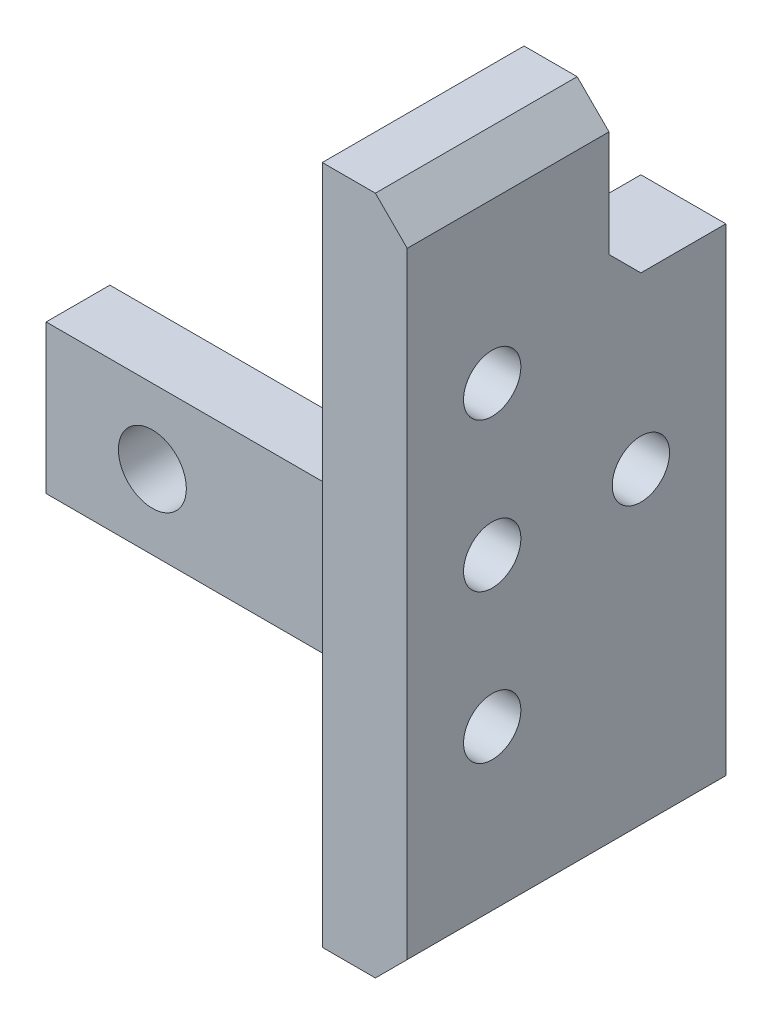
ISO-10303-21;
HEADER;
FILE_DESCRIPTION(('STEP AP214'),'2;1');
FILE_NAME('part.step','',(''),(''),'','','');
FILE_SCHEMA(('AUTOMOTIVE_DESIGN { 1 0 10303 214 1 1 1 1 }'));
ENDSEC;
DATA;
#1=APPLICATION_CONTEXT('core data for automotive mechanical design processes');
#2=APPLICATION_PROTOCOL_DEFINITION('international standard','automotive_design',2000,#1);
#3=PRODUCT_CONTEXT('',#1,'mechanical');
#4=PRODUCT('Part','Part','',(#3));
#5=PRODUCT_RELATED_PRODUCT_CATEGORY('part','',(#4));
#6=PRODUCT_DEFINITION_FORMATION('','',#4);
#7=PRODUCT_DEFINITION_CONTEXT('part definition',#1,'design');
#8=PRODUCT_DEFINITION('design','',#6,#7);
#9=PRODUCT_DEFINITION_SHAPE('','',#8);
#10=(LENGTH_UNIT() NAMED_UNIT(*) SI_UNIT(.MILLI.,.METRE.));
#11=(NAMED_UNIT(*) PLANE_ANGLE_UNIT() SI_UNIT($,.RADIAN.));
#12=(NAMED_UNIT(*) SI_UNIT($,.STERADIAN.) SOLID_ANGLE_UNIT());
#13=UNCERTAINTY_MEASURE_WITH_UNIT(LENGTH_MEASURE(1.E-05),#10,'distance_accuracy_value','');
#14=(GEOMETRIC_REPRESENTATION_CONTEXT(3) GLOBAL_UNCERTAINTY_ASSIGNED_CONTEXT((#13)) GLOBAL_UNIT_ASSIGNED_CONTEXT((#10,
#11,#12)) REPRESENTATION_CONTEXT('',''));
#15=CARTESIAN_POINT('',(0.,0.,0.));
#16=DIRECTION('',(0.,0.,1.));
#17=DIRECTION('',(1.,0.,0.));
#18=AXIS2_PLACEMENT_3D('',#15,#16,#17);
#19=CARTESIAN_POINT('',(0.,-3.5,3.));
#20=DIRECTION('',(0.,1.,0.));
#21=DIRECTION('',(-1.,0.,0.));
#22=AXIS2_PLACEMENT_3D('',#19,#20,#21);
#23=PLANE('',#22);
#24=DIRECTION('',(1.,0.,0.));
#25=VECTOR('',#24,1.);
#26=CARTESIAN_POINT('',(0.,-3.5,0.));
#27=LINE('',#26,#25);
#28=CARTESIAN_POINT('',(0.,-3.5,0.));
#29=VERTEX_POINT('',#28);
#30=CARTESIAN_POINT('',(27.5,-3.49999999999999,0.));
#31=VERTEX_POINT('',#30);
#32=EDGE_CURVE('E210',#29,#31,#27,.T.);
#33=ORIENTED_EDGE('',*,*,#32,.T.);
#34=DIRECTION('',(0.,0.,1.));
#35=VECTOR('',#34,1.);
#36=CARTESIAN_POINT('',(27.5,-3.49999999999999,15.));
#37=LINE('',#36,#35);
#38=CARTESIAN_POINT('',(27.5,-3.49999999999999,15.));
#39=VERTEX_POINT('',#38);
#40=EDGE_CURVE('E250',#31,#39,#37,.T.);
#41=ORIENTED_EDGE('',*,*,#40,.T.);
#42=DIRECTION('',(-1.,0.,0.));
#43=VECTOR('',#42,1.);
#44=CARTESIAN_POINT('',(29.,-3.49999999999999,15.));
#45=LINE('',#44,#43);
#46=CARTESIAN_POINT('',(25.,-3.49999999999999,15.));
#47=VERTEX_POINT('',#46);
#48=EDGE_CURVE('E192',#39,#47,#45,.T.);
#49=ORIENTED_EDGE('',*,*,#48,.T.);
#50=DIRECTION('',(0.,0.,-1.));
#51=VECTOR('',#50,1.);
#52=CARTESIAN_POINT('',(25.,-3.49999999999999,0.));
#53=LINE('',#52,#51);
#54=CARTESIAN_POINT('',(25.,-3.49999999999999,4.99999999999998));
#55=VERTEX_POINT('',#54);
#56=EDGE_CURVE('E149',#47,#55,#53,.T.);
#57=ORIENTED_EDGE('',*,*,#56,.T.);
#58=DIRECTION('',(-0.707106781186551,0.,-0.707106781186544));
#59=VECTOR('',#58,1.);
#60=CARTESIAN_POINT('',(11.4999999999999,-3.5,-8.5));
#61=LINE('',#60,#59);
#62=CARTESIAN_POINT('',(23.,-3.49999999999999,3.));
#63=VERTEX_POINT('',#62);
#64=EDGE_CURVE('E11',#55,#63,#61,.T.);
#65=ORIENTED_EDGE('',*,*,#64,.T.);
#66=DIRECTION('',(1.,0.,0.));
#67=VECTOR('',#66,1.);
#68=CARTESIAN_POINT('',(0.,-3.5,3.));
#69=LINE('',#68,#67);
#70=CARTESIAN_POINT('',(0.,-3.5,3.));
#71=VERTEX_POINT('',#70);
#72=EDGE_CURVE('E211',#71,#63,#69,.T.);
#73=ORIENTED_EDGE('',*,*,#72,.F.);
#74=DIRECTION('',(0.,0.,-1.));
#75=VECTOR('',#74,1.);
#76=CARTESIAN_POINT('',(0.,-3.5,3.));
#77=LINE('',#76,#75);
#78=EDGE_CURVE('E224',#71,#29,#77,.T.);
#79=ORIENTED_EDGE('',*,*,#78,.T.);
#80=EDGE_LOOP('',(#33,#41,#49,#57,#65,#73,#79));
#81=FACE_BOUND('',#80,.T.);
#82=ADVANCED_FACE('F41',(#81),#23,.F.);
#83=CARTESIAN_POINT('',(0.,3.5,3.));
#84=DIRECTION('',(0.,1.,0.));
#85=DIRECTION('',(0.,0.,1.));
#86=AXIS2_PLACEMENT_3D('',#83,#84,#85);
#87=PLANE('',#86);
#88=DIRECTION('',(1.,0.,0.));
#89=VECTOR('',#88,1.);
#90=CARTESIAN_POINT('',(0.,3.5,0.));
#91=LINE('',#90,#89);
#92=CARTESIAN_POINT('',(0.,3.5,0.));
#93=VERTEX_POINT('',#92);
#94=CARTESIAN_POINT('',(25.,3.5,0.));
#95=VERTEX_POINT('',#94);
#96=EDGE_CURVE('E228',#93,#95,#91,.T.);
#97=ORIENTED_EDGE('',*,*,#96,.F.);
#98=DIRECTION('',(0.,0.,-1.));
#99=VECTOR('',#98,1.);
#100=CARTESIAN_POINT('',(0.,3.5,3.));
#101=LINE('',#100,#99);
#102=CARTESIAN_POINT('',(0.,3.5,3.));
#103=VERTEX_POINT('',#102);
#104=EDGE_CURVE('E236',#103,#93,#101,.T.);
#105=ORIENTED_EDGE('',*,*,#104,.F.);
#106=DIRECTION('',(1.,0.,0.));
#107=VECTOR('',#106,1.);
#108=CARTESIAN_POINT('',(0.,3.5,3.));
#109=LINE('',#108,#107);
#110=CARTESIAN_POINT('',(23.,3.5,3.));
#111=VERTEX_POINT('',#110);
#112=EDGE_CURVE('E215',#103,#111,#109,.T.);
#113=ORIENTED_EDGE('',*,*,#112,.T.);
#114=DIRECTION('',(0.707106781186551,0.,0.707106781186544));
#115=VECTOR('',#114,1.);
#116=CARTESIAN_POINT('',(23.,3.5,3.));
#117=LINE('',#116,#115);
#118=CARTESIAN_POINT('',(25.,3.5,4.99999999999998));
#119=VERTEX_POINT('',#118);
#120=EDGE_CURVE('E51',#111,#119,#117,.T.);
#121=ORIENTED_EDGE('',*,*,#120,.T.);
#122=DIRECTION('',(0.,0.,-1.));
#123=VECTOR('',#122,1.);
#124=CARTESIAN_POINT('',(25.,3.5,3.));
#125=LINE('',#124,#123);
#126=EDGE_CURVE('E58',#119,#95,#125,.T.);
#127=ORIENTED_EDGE('',*,*,#126,.T.);
#128=EDGE_LOOP('',(#97,#105,#113,#121,#127));
#129=FACE_BOUND('',#128,.T.);
#130=ADVANCED_FACE('F284',(#129),#87,.T.);
#131=CARTESIAN_POINT('',(0.,-3.5,3.));
#132=DIRECTION('',(-1.,0.,0.));
#133=DIRECTION('',(0.,-1.,0.));
#134=AXIS2_PLACEMENT_3D('',#131,#132,#133);
#135=PLANE('',#134);
#136=DIRECTION('',(0.,1.,0.));
#137=VECTOR('',#136,1.);
#138=CARTESIAN_POINT('',(0.,-3.5,0.));
#139=LINE('',#138,#137);
#140=EDGE_CURVE('E216',#29,#93,#139,.T.);
#141=ORIENTED_EDGE('',*,*,#140,.F.);
#142=ORIENTED_EDGE('',*,*,#78,.F.);
#143=DIRECTION('',(0.,1.,0.));
#144=VECTOR('',#143,1.);
#145=CARTESIAN_POINT('',(0.,-3.5,3.));
#146=LINE('',#145,#144);
#147=EDGE_CURVE('E220',#71,#103,#146,.T.);
#148=ORIENTED_EDGE('',*,*,#147,.T.);
#149=ORIENTED_EDGE('',*,*,#104,.T.);
#150=EDGE_LOOP('',(#141,#142,#148,#149));
#151=FACE_BOUND('',#150,.T.);
#152=ADVANCED_FACE('F296',(#151),#135,.T.);
#153=CARTESIAN_POINT('',(0.,0.,3.));
#154=DIRECTION('',(0.,0.,1.));
#155=DIRECTION('',(1.,0.,0.));
#156=AXIS2_PLACEMENT_3D('',#153,#154,#155);
#157=PLANE('',#156);
#158=CARTESIAN_POINT('',(5.,0.,3.));
#159=DIRECTION('',(0.,0.,1.));
#160=DIRECTION('',(1.,0.,0.));
#161=AXIS2_PLACEMENT_3D('',#158,#159,#160);
#162=CIRCLE('',#161,1.6);
#163=CARTESIAN_POINT('',(6.6,0.,3.));
#164=VERTEX_POINT('',#163);
#165=EDGE_CURVE('E183',#164,#164,#162,.T.);
#166=ORIENTED_EDGE('',*,*,#165,.F.);
#167=EDGE_LOOP('',(#166));
#168=FACE_BOUND('',#167,.T.);
#169=CARTESIAN_POINT('',(20.,0.,3.));
#170=DIRECTION('',(0.,0.,1.));
#171=DIRECTION('',(1.,0.,0.));
#172=AXIS2_PLACEMENT_3D('',#169,#170,#171);
#173=CIRCLE('',#172,1.6);
#174=CARTESIAN_POINT('',(21.6,0.,3.));
#175=VERTEX_POINT('',#174);
#176=EDGE_CURVE('E168',#175,#175,#173,.T.);
#177=ORIENTED_EDGE('',*,*,#176,.F.);
#178=EDGE_LOOP('',(#177));
#179=FACE_BOUND('',#178,.T.);
#180=ORIENTED_EDGE('',*,*,#72,.T.);
#181=DIRECTION('',(0.,1.,0.));
#182=VECTOR('',#181,1.);
#183=CARTESIAN_POINT('',(23.,0.,3.));
#184=LINE('',#183,#182);
#185=EDGE_CURVE('E276',#63,#111,#184,.T.);
#186=ORIENTED_EDGE('',*,*,#185,.T.);
#187=ORIENTED_EDGE('',*,*,#112,.F.);
#188=ORIENTED_EDGE('',*,*,#147,.F.);
#189=EDGE_LOOP('',(#180,#186,#187,#188));
#190=FACE_BOUND('',#189,.T.);
#191=ADVANCED_FACE('F293',(#168,#179,#190),#157,.T.);
#192=CARTESIAN_POINT('',(0.,0.,0.));
#193=DIRECTION('',(0.,0.,1.));
#194=DIRECTION('',(1.,0.,0.));
#195=AXIS2_PLACEMENT_3D('',#192,#193,#194);
#196=PLANE('',#195);
#197=CARTESIAN_POINT('',(5.,0.,0.));
#198=DIRECTION('',(0.,0.,1.));
#199=DIRECTION('',(1.,0.,0.));
#200=AXIS2_PLACEMENT_3D('',#197,#198,#199);
#201=CIRCLE('',#200,1.6);
#202=CARTESIAN_POINT('',(6.6,0.,0.));
#203=VERTEX_POINT('',#202);
#204=EDGE_CURVE('E179',#203,#203,#201,.T.);
#205=ORIENTED_EDGE('',*,*,#204,.T.);
#206=EDGE_LOOP('',(#205));
#207=FACE_BOUND('',#206,.T.);
#208=CARTESIAN_POINT('',(20.,0.,0.));
#209=DIRECTION('',(0.,0.,1.));
#210=DIRECTION('',(1.,0.,0.));
#211=AXIS2_PLACEMENT_3D('',#208,#209,#210);
#212=CIRCLE('',#211,1.6);
#213=CARTESIAN_POINT('',(21.6,0.,0.));
#214=VERTEX_POINT('',#213);
#215=EDGE_CURVE('E173',#214,#214,#212,.T.);
#216=ORIENTED_EDGE('',*,*,#215,.T.);
#217=EDGE_LOOP('',(#216));
#218=FACE_BOUND('',#217,.T.);
#219=DIRECTION('',(0.,1.,0.));
#220=VECTOR('',#219,1.);
#221=CARTESIAN_POINT('',(29.,-3.49999999999999,0.));
#222=LINE('',#221,#220);
#223=CARTESIAN_POINT('',(29.,-1.99999999999999,0.));
#224=VERTEX_POINT('',#223);
#225=CARTESIAN_POINT('',(29.,20.5,0.));
#226=VERTEX_POINT('',#225);
#227=EDGE_CURVE('E138',#224,#226,#222,.T.);
#228=ORIENTED_EDGE('',*,*,#227,.F.);
#229=DIRECTION('',(-0.707106781186549,-0.707106781186546,0.));
#230=VECTOR('',#229,1.);
#231=CARTESIAN_POINT('',(29.,-1.99999999999999,0.));
#232=LINE('',#231,#230);
#233=EDGE_CURVE('E247',#224,#31,#232,.T.);
#234=ORIENTED_EDGE('',*,*,#233,.T.);
#235=ORIENTED_EDGE('',*,*,#32,.F.);
#236=ORIENTED_EDGE('',*,*,#140,.T.);
#237=ORIENTED_EDGE('',*,*,#96,.T.);
#238=DIRECTION('',(0.,1.,0.));
#239=VECTOR('',#238,1.);
#240=CARTESIAN_POINT('',(25.,-3.49999999999999,0.));
#241=LINE('',#240,#239);
#242=CARTESIAN_POINT('',(25.,20.5,0.));
#243=VERTEX_POINT('',#242);
#244=EDGE_CURVE('E166',#95,#243,#241,.T.);
#245=ORIENTED_EDGE('',*,*,#244,.T.);
#246=DIRECTION('',(1.,0.,0.));
#247=VECTOR('',#246,1.);
#248=CARTESIAN_POINT('',(-0.001000000000001,20.5,0.));
#249=LINE('',#248,#247);
#250=EDGE_CURVE('E155',#243,#226,#249,.T.);
#251=ORIENTED_EDGE('',*,*,#250,.T.);
#252=EDGE_LOOP('',(#228,#234,#235,#236,#237,#245,#251));
#253=FACE_BOUND('',#252,.T.);
#254=ADVANCED_FACE('F164',(#207,#218,#253),#196,.F.);
#255=CARTESIAN_POINT('',(29.,28.5,0.));
#256=DIRECTION('',(0.,-1.,0.));
#257=DIRECTION('',(0.,0.,-1.));
#258=AXIS2_PLACEMENT_3D('',#255,#256,#257);
#259=PLANE('',#258);
#260=DIRECTION('',(-1.,0.,0.));
#261=VECTOR('',#260,1.);
#262=CARTESIAN_POINT('',(29.,28.5,15.));
#263=LINE('',#262,#261);
#264=CARTESIAN_POINT('',(27.5,28.5,15.));
#265=VERTEX_POINT('',#264);
#266=CARTESIAN_POINT('',(25.,28.5,15.));
#267=VERTEX_POINT('',#266);
#268=EDGE_CURVE('E207',#265,#267,#263,.T.);
#269=ORIENTED_EDGE('',*,*,#268,.F.);
#270=DIRECTION('',(0.,0.,-1.));
#271=VECTOR('',#270,1.);
#272=CARTESIAN_POINT('',(27.5,28.5,5.5));
#273=LINE('',#272,#271);
#274=CARTESIAN_POINT('',(27.5,28.5,5.5));
#275=VERTEX_POINT('',#274);
#276=EDGE_CURVE('E259',#265,#275,#273,.T.);
#277=ORIENTED_EDGE('',*,*,#276,.T.);
#278=DIRECTION('',(1.,0.,0.));
#279=VECTOR('',#278,1.);
#280=CARTESIAN_POINT('',(-0.001000000000001,28.5,5.5));
#281=LINE('',#280,#279);
#282=CARTESIAN_POINT('',(25.,28.5,5.5));
#283=VERTEX_POINT('',#282);
#284=EDGE_CURVE('E160',#283,#275,#281,.T.);
#285=ORIENTED_EDGE('',*,*,#284,.F.);
#286=DIRECTION('',(0.,0.,1.));
#287=VECTOR('',#286,1.);
#288=CARTESIAN_POINT('',(25.,28.5,0.));
#289=LINE('',#288,#287);
#290=EDGE_CURVE('E195',#283,#267,#289,.T.);
#291=ORIENTED_EDGE('',*,*,#290,.T.);
#292=EDGE_LOOP('',(#269,#277,#285,#291));
#293=FACE_BOUND('',#292,.T.);
#294=ADVANCED_FACE('F443',(#293),#259,.F.);
#295=CARTESIAN_POINT('',(29.,-3.49999999999999,15.));
#296=DIRECTION('',(0.,0.,-1.));
#297=DIRECTION('',(-1.,0.,0.));
#298=AXIS2_PLACEMENT_3D('',#295,#296,#297);
#299=PLANE('',#298);
#300=ORIENTED_EDGE('',*,*,#48,.F.);
#301=DIRECTION('',(0.707106781186549,0.707106781186546,0.));
#302=VECTOR('',#301,1.);
#303=CARTESIAN_POINT('',(29.,-1.99999999999999,15.));
#304=LINE('',#303,#302);
#305=CARTESIAN_POINT('',(29.,-1.99999999999999,15.));
#306=VERTEX_POINT('',#305);
#307=EDGE_CURVE('E256',#39,#306,#304,.T.);
#308=ORIENTED_EDGE('',*,*,#307,.T.);
#309=DIRECTION('',(0.,-1.,0.));
#310=VECTOR('',#309,1.);
#311=CARTESIAN_POINT('',(29.,-3.49999999999999,15.));
#312=LINE('',#311,#310);
#313=CARTESIAN_POINT('',(29.,27.,15.));
#314=VERTEX_POINT('',#313);
#315=EDGE_CURVE('E148',#314,#306,#312,.T.);
#316=ORIENTED_EDGE('',*,*,#315,.F.);
#317=DIRECTION('',(-0.707106781186549,0.707106781186546,0.));
#318=VECTOR('',#317,1.);
#319=CARTESIAN_POINT('',(29.,27.,15.));
#320=LINE('',#319,#318);
#321=EDGE_CURVE('E253',#314,#265,#320,.T.);
#322=ORIENTED_EDGE('',*,*,#321,.T.);
#323=ORIENTED_EDGE('',*,*,#268,.T.);
#324=DIRECTION('',(0.,-1.,0.));
#325=VECTOR('',#324,1.);
#326=CARTESIAN_POINT('',(25.,-3.49999999999999,15.));
#327=LINE('',#326,#325);
#328=EDGE_CURVE('E199',#267,#47,#327,.T.);
#329=ORIENTED_EDGE('',*,*,#328,.T.);
#330=EDGE_LOOP('',(#300,#308,#316,#322,#323,#329));
#331=FACE_BOUND('',#330,.T.);
#332=ADVANCED_FACE('F304',(#331),#299,.F.);
#333=CARTESIAN_POINT('',(29.,0.,0.));
#334=DIRECTION('',(1.,0.,0.));
#335=DIRECTION('',(0.,0.,-1.));
#336=AXIS2_PLACEMENT_3D('',#333,#334,#335);
#337=PLANE('',#336);
#338=CARTESIAN_POINT('',(29.,19.5,11.));
#339=DIRECTION('',(1.,0.,0.));
#340=DIRECTION('',(0.,0.,-1.));
#341=AXIS2_PLACEMENT_3D('',#338,#339,#340);
#342=CIRCLE('',#341,1.35);
#343=CARTESIAN_POINT('',(29.,19.5,9.65));
#344=VERTEX_POINT('',#343);
#345=EDGE_CURVE('E381',#344,#344,#342,.T.);
#346=ORIENTED_EDGE('',*,*,#345,.F.);
#347=EDGE_LOOP('',(#346));
#348=FACE_BOUND('',#347,.T.);
#349=CARTESIAN_POINT('',(29.,5.50000000000001,11.));
#350=DIRECTION('',(1.,0.,0.));
#351=DIRECTION('',(0.,0.,-1.));
#352=AXIS2_PLACEMENT_3D('',#349,#350,#351);
#353=CIRCLE('',#352,1.35);
#354=CARTESIAN_POINT('',(29.,5.50000000000001,9.65));
#355=VERTEX_POINT('',#354);
#356=EDGE_CURVE('E380',#355,#355,#353,.T.);
#357=ORIENTED_EDGE('',*,*,#356,.F.);
#358=EDGE_LOOP('',(#357));
#359=FACE_BOUND('',#358,.T.);
#360=CARTESIAN_POINT('',(29.,12.5,4.));
#361=DIRECTION('',(1.,0.,0.));
#362=DIRECTION('',(0.,0.,-1.));
#363=AXIS2_PLACEMENT_3D('',#360,#361,#362);
#364=CIRCLE('',#363,1.35);
#365=CARTESIAN_POINT('',(29.,12.5,2.65));
#366=VERTEX_POINT('',#365);
#367=EDGE_CURVE('E389',#366,#366,#364,.T.);
#368=ORIENTED_EDGE('',*,*,#367,.F.);
#369=EDGE_LOOP('',(#368));
#370=FACE_BOUND('',#369,.T.);
#371=CARTESIAN_POINT('',(29.,12.5,11.));
#372=DIRECTION('',(1.,0.,0.));
#373=DIRECTION('',(0.,0.,-1.));
#374=AXIS2_PLACEMENT_3D('',#371,#372,#373);
#375=CIRCLE('',#374,1.35);
#376=CARTESIAN_POINT('',(29.,12.5,9.65));
#377=VERTEX_POINT('',#376);
#378=EDGE_CURVE('E371',#377,#377,#375,.T.);
#379=ORIENTED_EDGE('',*,*,#378,.F.);
#380=EDGE_LOOP('',(#379));
#381=FACE_BOUND('',#380,.T.);
#382=ORIENTED_EDGE('',*,*,#315,.T.);
#383=DIRECTION('',(0.,0.,-1.));
#384=VECTOR('',#383,1.);
#385=CARTESIAN_POINT('',(29.,-1.99999999999999,0.));
#386=LINE('',#385,#384);
#387=EDGE_CURVE('E144',#306,#224,#386,.T.);
#388=ORIENTED_EDGE('',*,*,#387,.T.);
#389=ORIENTED_EDGE('',*,*,#227,.T.);
#390=DIRECTION('',(0.,0.,-1.));
#391=VECTOR('',#390,1.);
#392=CARTESIAN_POINT('',(29.,20.5,0.));
#393=LINE('',#392,#391);
#394=CARTESIAN_POINT('',(29.,20.5,4.));
#395=VERTEX_POINT('',#394);
#396=EDGE_CURVE('E142',#395,#226,#393,.T.);
#397=ORIENTED_EDGE('',*,*,#396,.F.);
#398=DIRECTION('',(0.,-0.707106781186544,-0.707106781186551));
#399=VECTOR('',#398,1.);
#400=CARTESIAN_POINT('',(29.,20.5,4.));
#401=LINE('',#400,#399);
#402=CARTESIAN_POINT('',(29.,22.,5.5));
#403=VERTEX_POINT('',#402);
#404=EDGE_CURVE('E270',#395,#403,#401,.F.);
#405=ORIENTED_EDGE('',*,*,#404,.T.);
#406=DIRECTION('',(0.,-1.,0.));
#407=VECTOR('',#406,1.);
#408=CARTESIAN_POINT('',(29.,28.5,5.5));
#409=LINE('',#408,#407);
#410=CARTESIAN_POINT('',(29.,27.,5.5));
#411=VERTEX_POINT('',#410);
#412=EDGE_CURVE('E161',#411,#403,#409,.T.);
#413=ORIENTED_EDGE('',*,*,#412,.F.);
#414=DIRECTION('',(0.,0.,1.));
#415=VECTOR('',#414,1.);
#416=CARTESIAN_POINT('',(29.,27.,15.));
#417=LINE('',#416,#415);
#418=EDGE_CURVE('E241',#411,#314,#417,.T.);
#419=ORIENTED_EDGE('',*,*,#418,.T.);
#420=EDGE_LOOP('',(#382,#388,#389,#397,#405,#413,#419));
#421=FACE_BOUND('',#420,.T.);
#422=ADVANCED_FACE('F141',(#348,#359,#370,#381,#421),#337,.T.);
#423=CARTESIAN_POINT('',(25.,0.,0.));
#424=DIRECTION('',(1.,0.,0.));
#425=DIRECTION('',(0.,0.,-1.));
#426=AXIS2_PLACEMENT_3D('',#423,#424,#425);
#427=PLANE('',#426);
#428=CARTESIAN_POINT('',(25.,19.5,11.));
#429=DIRECTION('',(1.,0.,0.));
#430=DIRECTION('',(0.,0.,-1.));
#431=AXIS2_PLACEMENT_3D('',#428,#429,#430);
#432=CIRCLE('',#431,1.35);
#433=CARTESIAN_POINT('',(25.,19.5,9.65));
#434=VERTEX_POINT('',#433);
#435=EDGE_CURVE('E376',#434,#434,#432,.F.);
#436=ORIENTED_EDGE('',*,*,#435,.F.);
#437=EDGE_LOOP('',(#436));
#438=FACE_BOUND('',#437,.T.);
#439=CARTESIAN_POINT('',(25.,5.50000000000001,11.));
#440=DIRECTION('',(1.,0.,0.));
#441=DIRECTION('',(0.,0.,-1.));
#442=AXIS2_PLACEMENT_3D('',#439,#440,#441);
#443=CIRCLE('',#442,1.35);
#444=CARTESIAN_POINT('',(25.,5.50000000000001,9.65));
#445=VERTEX_POINT('',#444);
#446=EDGE_CURVE('E385',#445,#445,#443,.F.);
#447=ORIENTED_EDGE('',*,*,#446,.F.);
#448=EDGE_LOOP('',(#447));
#449=FACE_BOUND('',#448,.T.);
#450=CARTESIAN_POINT('',(25.,12.5,4.));
#451=DIRECTION('',(1.,0.,0.));
#452=DIRECTION('',(0.,0.,-1.));
#453=AXIS2_PLACEMENT_3D('',#450,#451,#452);
#454=CIRCLE('',#453,1.35);
#455=CARTESIAN_POINT('',(25.,12.5,2.65));
#456=VERTEX_POINT('',#455);
#457=EDGE_CURVE('E375',#456,#456,#454,.F.);
#458=ORIENTED_EDGE('',*,*,#457,.F.);
#459=EDGE_LOOP('',(#458));
#460=FACE_BOUND('',#459,.T.);
#461=CARTESIAN_POINT('',(25.,12.5,11.));
#462=DIRECTION('',(1.,0.,0.));
#463=DIRECTION('',(0.,0.,-1.));
#464=AXIS2_PLACEMENT_3D('',#461,#462,#463);
#465=CIRCLE('',#464,1.35);
#466=CARTESIAN_POINT('',(25.,12.5,9.65));
#467=VERTEX_POINT('',#466);
#468=EDGE_CURVE('E365',#467,#467,#465,.F.);
#469=ORIENTED_EDGE('',*,*,#468,.F.);
#470=EDGE_LOOP('',(#469));
#471=FACE_BOUND('',#470,.T.);
#472=ORIENTED_EDGE('',*,*,#126,.F.);
#473=DIRECTION('',(0.,-1.,0.));
#474=VECTOR('',#473,1.);
#475=CARTESIAN_POINT('',(25.,0.,4.99999999999998));
#476=LINE('',#475,#474);
#477=EDGE_CURVE('E63',#119,#55,#476,.T.);
#478=ORIENTED_EDGE('',*,*,#477,.T.);
#479=ORIENTED_EDGE('',*,*,#56,.F.);
#480=ORIENTED_EDGE('',*,*,#328,.F.);
#481=ORIENTED_EDGE('',*,*,#290,.F.);
#482=DIRECTION('',(0.,1.,0.));
#483=VECTOR('',#482,1.);
#484=CARTESIAN_POINT('',(25.,28.5,5.5));
#485=LINE('',#484,#483);
#486=CARTESIAN_POINT('',(25.,22.,5.5));
#487=VERTEX_POINT('',#486);
#488=EDGE_CURVE('E359',#487,#283,#485,.T.);
#489=ORIENTED_EDGE('',*,*,#488,.F.);
#490=DIRECTION('',(0.,0.707106781186544,0.707106781186551));
#491=VECTOR('',#490,1.);
#492=CARTESIAN_POINT('',(25.,8.2500000000001,-8.25000000000002));
#493=LINE('',#492,#491);
#494=CARTESIAN_POINT('',(25.,20.5,4.));
#495=VERTEX_POINT('',#494);
#496=EDGE_CURVE('E273',#487,#495,#493,.F.);
#497=ORIENTED_EDGE('',*,*,#496,.T.);
#498=DIRECTION('',(0.,0.,1.));
#499=VECTOR('',#498,1.);
#500=CARTESIAN_POINT('',(25.,20.5,0.));
#501=LINE('',#500,#499);
#502=EDGE_CURVE('E358',#243,#495,#501,.T.);
#503=ORIENTED_EDGE('',*,*,#502,.F.);
#504=ORIENTED_EDGE('',*,*,#244,.F.);
#505=EDGE_LOOP('',(#472,#478,#479,#480,#481,#489,#497,#503,#504));
#506=FACE_BOUND('',#505,.T.);
#507=ADVANCED_FACE('F309',(#438,#449,#460,#471,#506),#427,.F.);
#508=CARTESIAN_POINT('',(20.,0.,0.));
#509=DIRECTION('',(0.,0.,1.));
#510=DIRECTION('',(1.,0.,0.));
#511=AXIS2_PLACEMENT_3D('',#508,#509,#510);
#512=CYLINDRICAL_SURFACE('',#511,1.6);
#513=ORIENTED_EDGE('',*,*,#215,.F.);
#514=EDGE_LOOP('',(#513));
#515=FACE_BOUND('',#514,.T.);
#516=ORIENTED_EDGE('',*,*,#176,.T.);
#517=EDGE_LOOP('',(#516));
#518=FACE_BOUND('',#517,.T.);
#519=ADVANCED_FACE('F311',(#515,#518),#512,.F.);
#520=CARTESIAN_POINT('',(5.,0.,0.));
#521=DIRECTION('',(0.,0.,1.));
#522=DIRECTION('',(1.,0.,0.));
#523=AXIS2_PLACEMENT_3D('',#520,#521,#522);
#524=CYLINDRICAL_SURFACE('',#523,1.6);
#525=ORIENTED_EDGE('',*,*,#204,.F.);
#526=EDGE_LOOP('',(#525));
#527=FACE_BOUND('',#526,.T.);
#528=ORIENTED_EDGE('',*,*,#165,.T.);
#529=EDGE_LOOP('',(#528));
#530=FACE_BOUND('',#529,.T.);
#531=ADVANCED_FACE('F318',(#527,#530),#524,.F.);
#532=CARTESIAN_POINT('',(-0.001000000000001,20.5,0.));
#533=DIRECTION('',(0.,-1.,0.));
#534=DIRECTION('',(0.,0.,-1.));
#535=AXIS2_PLACEMENT_3D('',#532,#533,#534);
#536=PLANE('',#535);
#537=ORIENTED_EDGE('',*,*,#502,.T.);
#538=DIRECTION('',(1.,0.,0.));
#539=VECTOR('',#538,1.);
#540=CARTESIAN_POINT('',(29.,20.5,4.));
#541=LINE('',#540,#539);
#542=EDGE_CURVE('E158',#495,#395,#541,.T.);
#543=ORIENTED_EDGE('',*,*,#542,.T.);
#544=ORIENTED_EDGE('',*,*,#396,.T.);
#545=ORIENTED_EDGE('',*,*,#250,.F.);
#546=EDGE_LOOP('',(#537,#543,#544,#545));
#547=FACE_BOUND('',#546,.T.);
#548=ADVANCED_FACE('F154',(#547),#536,.F.);
#549=CARTESIAN_POINT('',(-0.001000000000001,28.5,5.5));
#550=DIRECTION('',(0.,0.,1.));
#551=DIRECTION('',(0.,-1.,0.));
#552=AXIS2_PLACEMENT_3D('',#549,#550,#551);
#553=PLANE('',#552);
#554=ORIENTED_EDGE('',*,*,#284,.T.);
#555=DIRECTION('',(0.707106781186549,-0.707106781186546,0.));
#556=VECTOR('',#555,1.);
#557=CARTESIAN_POINT('',(29.,27.,5.5));
#558=LINE('',#557,#556);
#559=EDGE_CURVE('E265',#275,#411,#558,.T.);
#560=ORIENTED_EDGE('',*,*,#559,.T.);
#561=ORIENTED_EDGE('',*,*,#412,.T.);
#562=DIRECTION('',(-1.,0.,0.));
#563=VECTOR('',#562,1.);
#564=CARTESIAN_POINT('',(25.,22.,5.5));
#565=LINE('',#564,#563);
#566=EDGE_CURVE('E262',#403,#487,#565,.T.);
#567=ORIENTED_EDGE('',*,*,#566,.T.);
#568=ORIENTED_EDGE('',*,*,#488,.T.);
#569=EDGE_LOOP('',(#554,#560,#561,#567,#568));
#570=FACE_BOUND('',#569,.T.);
#571=ADVANCED_FACE('F409',(#570),#553,.F.);
#572=CARTESIAN_POINT('',(-0.001000000000001,12.5,11.));
#573=DIRECTION('',(1.,0.,0.));
#574=DIRECTION('',(0.,0.,-1.));
#575=AXIS2_PLACEMENT_3D('',#572,#573,#574);
#576=CYLINDRICAL_SURFACE('',#575,1.35);
#577=ORIENTED_EDGE('',*,*,#378,.T.);
#578=EDGE_LOOP('',(#577));
#579=FACE_BOUND('',#578,.T.);
#580=ORIENTED_EDGE('',*,*,#468,.T.);
#581=EDGE_LOOP('',(#580));
#582=FACE_BOUND('',#581,.T.);
#583=ADVANCED_FACE('F406',(#579,#582),#576,.F.);
#584=CARTESIAN_POINT('',(-0.001000000000001,12.5,4.));
#585=DIRECTION('',(1.,0.,0.));
#586=DIRECTION('',(0.,0.,-1.));
#587=AXIS2_PLACEMENT_3D('',#584,#585,#586);
#588=CYLINDRICAL_SURFACE('',#587,1.35);
#589=ORIENTED_EDGE('',*,*,#367,.T.);
#590=EDGE_LOOP('',(#589));
#591=FACE_BOUND('',#590,.T.);
#592=ORIENTED_EDGE('',*,*,#457,.T.);
#593=EDGE_LOOP('',(#592));
#594=FACE_BOUND('',#593,.T.);
#595=ADVANCED_FACE('F400',(#591,#594),#588,.F.);
#596=CARTESIAN_POINT('',(-0.001000000000001,5.50000000000001,11.));
#597=DIRECTION('',(1.,0.,0.));
#598=DIRECTION('',(0.,0.,-1.));
#599=AXIS2_PLACEMENT_3D('',#596,#597,#598);
#600=CYLINDRICAL_SURFACE('',#599,1.35);
#601=ORIENTED_EDGE('',*,*,#356,.T.);
#602=EDGE_LOOP('',(#601));
#603=FACE_BOUND('',#602,.T.);
#604=ORIENTED_EDGE('',*,*,#446,.T.);
#605=EDGE_LOOP('',(#604));
#606=FACE_BOUND('',#605,.T.);
#607=ADVANCED_FACE('F417',(#603,#606),#600,.F.);
#608=CARTESIAN_POINT('',(-0.001000000000001,19.5,11.));
#609=DIRECTION('',(1.,0.,0.));
#610=DIRECTION('',(0.,0.,-1.));
#611=AXIS2_PLACEMENT_3D('',#608,#609,#610);
#612=CYLINDRICAL_SURFACE('',#611,1.35);
#613=ORIENTED_EDGE('',*,*,#345,.T.);
#614=EDGE_LOOP('',(#613));
#615=FACE_BOUND('',#614,.T.);
#616=ORIENTED_EDGE('',*,*,#435,.T.);
#617=EDGE_LOOP('',(#616));
#618=FACE_BOUND('',#617,.T.);
#619=ADVANCED_FACE('F341',(#615,#618),#612,.F.);
#620=CARTESIAN_POINT('',(29.,-1.99999999999999,0.));
#621=DIRECTION('',(0.707106781186546,-0.707106781186549,0.));
#622=DIRECTION('',(0.,0.,1.));
#623=AXIS2_PLACEMENT_3D('',#620,#621,#622);
#624=PLANE('',#623);
#625=ORIENTED_EDGE('',*,*,#307,.F.);
#626=ORIENTED_EDGE('',*,*,#40,.F.);
#627=ORIENTED_EDGE('',*,*,#233,.F.);
#628=ORIENTED_EDGE('',*,*,#387,.F.);
#629=EDGE_LOOP('',(#625,#626,#627,#628));
#630=FACE_BOUND('',#629,.T.);
#631=ADVANCED_FACE('F301',(#630),#624,.T.);
#632=CARTESIAN_POINT('',(29.,27.,0.));
#633=DIRECTION('',(0.707106781186546,0.707106781186549,0.));
#634=DIRECTION('',(0.,0.,-1.));
#635=AXIS2_PLACEMENT_3D('',#632,#633,#634);
#636=PLANE('',#635);
#637=ORIENTED_EDGE('',*,*,#559,.F.);
#638=ORIENTED_EDGE('',*,*,#276,.F.);
#639=ORIENTED_EDGE('',*,*,#321,.F.);
#640=ORIENTED_EDGE('',*,*,#418,.F.);
#641=EDGE_LOOP('',(#637,#638,#639,#640));
#642=FACE_BOUND('',#641,.T.);
#643=ADVANCED_FACE('F340',(#642),#636,.T.);
#644=CARTESIAN_POINT('',(-0.001000000000001,20.5,4.));
#645=DIRECTION('',(0.,0.707106781186551,-0.707106781186544));
#646=DIRECTION('',(-1.,0.,0.));
#647=AXIS2_PLACEMENT_3D('',#644,#645,#646);
#648=PLANE('',#647);
#649=ORIENTED_EDGE('',*,*,#496,.F.);
#650=ORIENTED_EDGE('',*,*,#566,.F.);
#651=ORIENTED_EDGE('',*,*,#404,.F.);
#652=ORIENTED_EDGE('',*,*,#542,.F.);
#653=EDGE_LOOP('',(#649,#650,#651,#652));
#654=FACE_BOUND('',#653,.T.);
#655=ADVANCED_FACE('F346',(#654),#648,.T.);
#656=CARTESIAN_POINT('',(23.,0.,3.));
#657=DIRECTION('',(0.707106781186544,0.,-0.707106781186551));
#658=DIRECTION('',(0.,1.,0.));
#659=AXIS2_PLACEMENT_3D('',#656,#657,#658);
#660=PLANE('',#659);
#661=ORIENTED_EDGE('',*,*,#64,.F.);
#662=ORIENTED_EDGE('',*,*,#477,.F.);
#663=ORIENTED_EDGE('',*,*,#120,.F.);
#664=ORIENTED_EDGE('',*,*,#185,.F.);
#665=EDGE_LOOP('',(#661,#662,#663,#664));
#666=FACE_BOUND('',#665,.T.);
#667=ADVANCED_FACE('F44',(#666),#660,.F.);
#668=CLOSED_SHELL('',(#82,#130,#152,#191,#254,#294,#332,#422,#507,#519,#531,#548,#571,#583,#595,
#607,#619,#631,#643,#655,#667));
#669=MANIFOLD_SOLID_BREP('B2',#668);
#670=ADVANCED_BREP_SHAPE_REPRESENTATION('',(#18,#669),#14);
#671=SHAPE_DEFINITION_REPRESENTATION(#9,#670);
ENDSEC;
END-ISO-10303-21;
